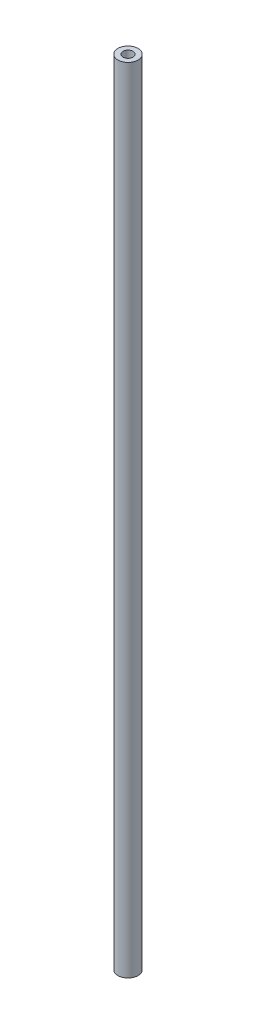
ISO-10303-21;
HEADER;
FILE_DESCRIPTION(('STEP AP214'),'2;1');
FILE_NAME('part.step','',(''),(''),'','','');
FILE_SCHEMA(('AUTOMOTIVE_DESIGN { 1 0 10303 214 1 1 1 1 }'));
ENDSEC;
DATA;
#1=APPLICATION_CONTEXT('core data for automotive mechanical design processes');
#2=APPLICATION_PROTOCOL_DEFINITION('international standard','automotive_design',2000,#1);
#3=PRODUCT_CONTEXT('',#1,'mechanical');
#4=PRODUCT('Part','Part','',(#3));
#5=PRODUCT_RELATED_PRODUCT_CATEGORY('part','',(#4));
#6=PRODUCT_DEFINITION_FORMATION('','',#4);
#7=PRODUCT_DEFINITION_CONTEXT('part definition',#1,'design');
#8=PRODUCT_DEFINITION('design','',#6,#7);
#9=PRODUCT_DEFINITION_SHAPE('','',#8);
#10=(LENGTH_UNIT() NAMED_UNIT(*) SI_UNIT(.MILLI.,.METRE.));
#11=(NAMED_UNIT(*) PLANE_ANGLE_UNIT() SI_UNIT($,.RADIAN.));
#12=(NAMED_UNIT(*) SI_UNIT($,.STERADIAN.) SOLID_ANGLE_UNIT());
#13=UNCERTAINTY_MEASURE_WITH_UNIT(LENGTH_MEASURE(1.E-05),#10,'distance_accuracy_value','');
#14=(GEOMETRIC_REPRESENTATION_CONTEXT(3) GLOBAL_UNCERTAINTY_ASSIGNED_CONTEXT((#13)) GLOBAL_UNIT_ASSIGNED_CONTEXT((#10,
#11,#12)) REPRESENTATION_CONTEXT('',''));
#15=CARTESIAN_POINT('',(0.,0.,0.));
#16=DIRECTION('',(0.,0.,1.));
#17=DIRECTION('',(1.,0.,0.));
#18=AXIS2_PLACEMENT_3D('',#15,#16,#17);
#19=CARTESIAN_POINT('',(0.,250.,0.));
#20=DIRECTION('',(0.,1.,0.));
#21=DIRECTION('',(0.,0.,1.));
#22=AXIS2_PLACEMENT_3D('',#19,#20,#21);
#23=PLANE('',#22);
#24=CARTESIAN_POINT('',(0.,250.,0.));
#25=DIRECTION('',(0.,1.,0.));
#26=DIRECTION('',(0.,0.,1.));
#27=AXIS2_PLACEMENT_3D('',#24,#25,#26);
#28=CIRCLE('',#27,3.175);
#29=CARTESIAN_POINT('',(0.,250.,3.175));
#30=VERTEX_POINT('',#29);
#31=EDGE_CURVE('E10',#30,#30,#28,.T.);
#32=ORIENTED_EDGE('',*,*,#31,.T.);
#33=EDGE_LOOP('',(#32));
#34=FACE_BOUND('',#33,.T.);
#35=CARTESIAN_POINT('',(0.,250.,0.));
#36=DIRECTION('',(0.,1.,0.));
#37=DIRECTION('',(0.,0.,1.));
#38=AXIS2_PLACEMENT_3D('',#35,#36,#37);
#39=CIRCLE('',#38,1.5875);
#40=CARTESIAN_POINT('',(0.,250.,1.5875));
#41=VERTEX_POINT('',#40);
#42=EDGE_CURVE('E42',#41,#41,#39,.T.);
#43=ORIENTED_EDGE('',*,*,#42,.F.);
#44=EDGE_LOOP('',(#43));
#45=FACE_BOUND('',#44,.T.);
#46=ADVANCED_FACE('F31',(#34,#45),#23,.T.);
#47=CARTESIAN_POINT('',(0.,0.,0.));
#48=DIRECTION('',(0.,1.,0.));
#49=DIRECTION('',(0.,0.,1.));
#50=AXIS2_PLACEMENT_3D('',#47,#48,#49);
#51=PLANE('',#50);
#52=CARTESIAN_POINT('',(0.,0.,0.));
#53=DIRECTION('',(0.,1.,0.));
#54=DIRECTION('',(0.,0.,1.));
#55=AXIS2_PLACEMENT_3D('',#52,#53,#54);
#56=CIRCLE('',#55,3.175);
#57=CARTESIAN_POINT('',(0.,0.,3.175));
#58=VERTEX_POINT('',#57);
#59=EDGE_CURVE('E35',#58,#58,#56,.T.);
#60=ORIENTED_EDGE('',*,*,#59,.F.);
#61=EDGE_LOOP('',(#60));
#62=FACE_BOUND('',#61,.T.);
#63=CARTESIAN_POINT('',(0.,0.,0.));
#64=DIRECTION('',(0.,1.,0.));
#65=DIRECTION('',(0.,0.,1.));
#66=AXIS2_PLACEMENT_3D('',#63,#64,#65);
#67=CIRCLE('',#66,1.5875);
#68=CARTESIAN_POINT('',(0.,0.,1.5875));
#69=VERTEX_POINT('',#68);
#70=EDGE_CURVE('E44',#69,#69,#67,.T.);
#71=ORIENTED_EDGE('',*,*,#70,.T.);
#72=EDGE_LOOP('',(#71));
#73=FACE_BOUND('',#72,.T.);
#74=ADVANCED_FACE('F54',(#62,#73),#51,.F.);
#75=CARTESIAN_POINT('',(0.,250.,0.));
#76=DIRECTION('',(0.,-1.,0.));
#77=DIRECTION('',(0.,0.,-1.));
#78=AXIS2_PLACEMENT_3D('',#75,#76,#77);
#79=CYLINDRICAL_SURFACE('',#78,3.175);
#80=ORIENTED_EDGE('',*,*,#31,.F.);
#81=EDGE_LOOP('',(#80));
#82=FACE_BOUND('',#81,.T.);
#83=ORIENTED_EDGE('',*,*,#59,.T.);
#84=EDGE_LOOP('',(#83));
#85=FACE_BOUND('',#84,.T.);
#86=ADVANCED_FACE('F33',(#82,#85),#79,.T.);
#87=CARTESIAN_POINT('',(0.,250.,0.));
#88=DIRECTION('',(0.,-1.,0.));
#89=DIRECTION('',(0.,0.,-1.));
#90=AXIS2_PLACEMENT_3D('',#87,#88,#89);
#91=CYLINDRICAL_SURFACE('',#90,1.5875);
#92=ORIENTED_EDGE('',*,*,#42,.T.);
#93=EDGE_LOOP('',(#92));
#94=FACE_BOUND('',#93,.T.);
#95=ORIENTED_EDGE('',*,*,#70,.F.);
#96=EDGE_LOOP('',(#95));
#97=FACE_BOUND('',#96,.T.);
#98=ADVANCED_FACE('F50',(#94,#97),#91,.F.);
#99=CLOSED_SHELL('',(#46,#74,#86,#98));
#100=MANIFOLD_SOLID_BREP('B2',#99);
#101=ADVANCED_BREP_SHAPE_REPRESENTATION('',(#18,#100),#14);
#102=SHAPE_DEFINITION_REPRESENTATION(#9,#101);
ENDSEC;
END-ISO-10303-21;
